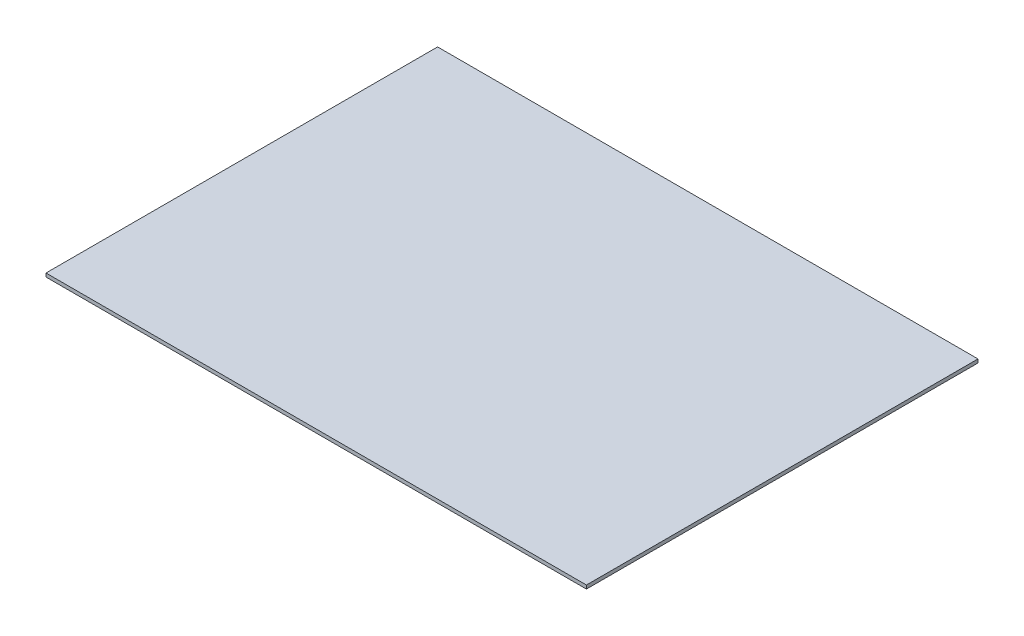
ISO-10303-21;
HEADER;
FILE_DESCRIPTION(('STEP AP214'),'2;1');
FILE_NAME('part.step','',(''),(''),'','','');
FILE_SCHEMA(('AUTOMOTIVE_DESIGN { 1 0 10303 214 1 1 1 1 }'));
ENDSEC;
DATA;
#1=APPLICATION_CONTEXT('core data for automotive mechanical design processes');
#2=APPLICATION_PROTOCOL_DEFINITION('international standard','automotive_design',2000,#1);
#3=PRODUCT_CONTEXT('',#1,'mechanical');
#4=PRODUCT('Part','Part','',(#3));
#5=PRODUCT_RELATED_PRODUCT_CATEGORY('part','',(#4));
#6=PRODUCT_DEFINITION_FORMATION('','',#4);
#7=PRODUCT_DEFINITION_CONTEXT('part definition',#1,'design');
#8=PRODUCT_DEFINITION('design','',#6,#7);
#9=PRODUCT_DEFINITION_SHAPE('','',#8);
#10=(LENGTH_UNIT() NAMED_UNIT(*) SI_UNIT(.MILLI.,.METRE.));
#11=(NAMED_UNIT(*) PLANE_ANGLE_UNIT() SI_UNIT($,.RADIAN.));
#12=(NAMED_UNIT(*) SI_UNIT($,.STERADIAN.) SOLID_ANGLE_UNIT());
#13=UNCERTAINTY_MEASURE_WITH_UNIT(LENGTH_MEASURE(1.E-05),#10,'distance_accuracy_value','');
#14=(GEOMETRIC_REPRESENTATION_CONTEXT(3) GLOBAL_UNCERTAINTY_ASSIGNED_CONTEXT((#13)) GLOBAL_UNIT_ASSIGNED_CONTEXT((#10,
#11,#12)) REPRESENTATION_CONTEXT('',''));
#15=CARTESIAN_POINT('',(0.,0.,0.));
#16=DIRECTION('',(0.,0.,1.));
#17=DIRECTION('',(1.,0.,0.));
#18=AXIS2_PLACEMENT_3D('',#15,#16,#17);
#19=CARTESIAN_POINT('',(-762.5,-10.,-552.5));
#20=DIRECTION('',(-1.,0.,0.));
#21=DIRECTION('',(0.,0.,1.));
#22=AXIS2_PLACEMENT_3D('',#19,#20,#21);
#23=PLANE('',#22);
#24=DIRECTION('',(0.,0.,1.));
#25=VECTOR('',#24,1.);
#26=CARTESIAN_POINT('',(-762.5,0.,-552.5));
#27=LINE('',#26,#25);
#28=CARTESIAN_POINT('',(-762.5,0.,-552.5));
#29=VERTEX_POINT('',#28);
#30=CARTESIAN_POINT('',(-762.5,0.,552.5));
#31=VERTEX_POINT('',#30);
#32=EDGE_CURVE('E117',#29,#31,#27,.T.);
#33=ORIENTED_EDGE('',*,*,#32,.F.);
#34=DIRECTION('',(0.,1.,0.));
#35=VECTOR('',#34,1.);
#36=CARTESIAN_POINT('',(-762.5,-10.,-552.5));
#37=LINE('',#36,#35);
#38=CARTESIAN_POINT('',(-762.5,-10.,-552.5));
#39=VERTEX_POINT('',#38);
#40=EDGE_CURVE('E11',#39,#29,#37,.T.);
#41=ORIENTED_EDGE('',*,*,#40,.F.);
#42=DIRECTION('',(0.,0.,1.));
#43=VECTOR('',#42,1.);
#44=CARTESIAN_POINT('',(-762.5,-10.,-552.5));
#45=LINE('',#44,#43);
#46=CARTESIAN_POINT('',(-762.5,-10.,552.5));
#47=VERTEX_POINT('',#46);
#48=EDGE_CURVE('E107',#39,#47,#45,.T.);
#49=ORIENTED_EDGE('',*,*,#48,.T.);
#50=DIRECTION('',(0.,1.,0.));
#51=VECTOR('',#50,1.);
#52=CARTESIAN_POINT('',(-762.5,-10.,552.5));
#53=LINE('',#52,#51);
#54=EDGE_CURVE('E48',#47,#31,#53,.T.);
#55=ORIENTED_EDGE('',*,*,#54,.T.);
#56=EDGE_LOOP('',(#33,#41,#49,#55));
#57=FACE_BOUND('',#56,.T.);
#58=ADVANCED_FACE('F45',(#57),#23,.T.);
#59=CARTESIAN_POINT('',(-762.5,-10.,-552.5));
#60=DIRECTION('',(0.,0.,-1.));
#61=DIRECTION('',(-1.,0.,0.));
#62=AXIS2_PLACEMENT_3D('',#59,#60,#61);
#63=PLANE('',#62);
#64=DIRECTION('',(-1.,0.,0.));
#65=VECTOR('',#64,1.);
#66=CARTESIAN_POINT('',(-762.5,0.,-552.5));
#67=LINE('',#66,#65);
#68=CARTESIAN_POINT('',(762.5,0.,-552.5));
#69=VERTEX_POINT('',#68);
#70=EDGE_CURVE('E112',#69,#29,#67,.T.);
#71=ORIENTED_EDGE('',*,*,#70,.F.);
#72=DIRECTION('',(0.,1.,0.));
#73=VECTOR('',#72,1.);
#74=CARTESIAN_POINT('',(762.5,-10.,-552.5));
#75=LINE('',#74,#73);
#76=CARTESIAN_POINT('',(762.5,-10.,-552.5));
#77=VERTEX_POINT('',#76);
#78=EDGE_CURVE('E54',#77,#69,#75,.T.);
#79=ORIENTED_EDGE('',*,*,#78,.F.);
#80=DIRECTION('',(-1.,0.,0.));
#81=VECTOR('',#80,1.);
#82=CARTESIAN_POINT('',(-762.5,-10.,-552.5));
#83=LINE('',#82,#81);
#84=EDGE_CURVE('E102',#77,#39,#83,.T.);
#85=ORIENTED_EDGE('',*,*,#84,.T.);
#86=ORIENTED_EDGE('',*,*,#40,.T.);
#87=EDGE_LOOP('',(#71,#79,#85,#86));
#88=FACE_BOUND('',#87,.T.);
#89=ADVANCED_FACE('F130',(#88),#63,.T.);
#90=CARTESIAN_POINT('',(762.5,-10.,-552.5));
#91=DIRECTION('',(1.,0.,0.));
#92=DIRECTION('',(0.,0.,-1.));
#93=AXIS2_PLACEMENT_3D('',#90,#91,#92);
#94=PLANE('',#93);
#95=DIRECTION('',(0.,0.,-1.));
#96=VECTOR('',#95,1.);
#97=CARTESIAN_POINT('',(762.5,0.,-552.5));
#98=LINE('',#97,#96);
#99=CARTESIAN_POINT('',(762.5,0.,552.5));
#100=VERTEX_POINT('',#99);
#101=EDGE_CURVE('E97',#100,#69,#98,.T.);
#102=ORIENTED_EDGE('',*,*,#101,.F.);
#103=DIRECTION('',(0.,1.,0.));
#104=VECTOR('',#103,1.);
#105=CARTESIAN_POINT('',(762.5,-10.,552.5));
#106=LINE('',#105,#104);
#107=CARTESIAN_POINT('',(762.5,-10.,552.5));
#108=VERTEX_POINT('',#107);
#109=EDGE_CURVE('E92',#108,#100,#106,.T.);
#110=ORIENTED_EDGE('',*,*,#109,.F.);
#111=DIRECTION('',(0.,0.,-1.));
#112=VECTOR('',#111,1.);
#113=CARTESIAN_POINT('',(762.5,-10.,-552.5));
#114=LINE('',#113,#112);
#115=EDGE_CURVE('E95',#108,#77,#114,.T.);
#116=ORIENTED_EDGE('',*,*,#115,.T.);
#117=ORIENTED_EDGE('',*,*,#78,.T.);
#118=EDGE_LOOP('',(#102,#110,#116,#117));
#119=FACE_BOUND('',#118,.T.);
#120=ADVANCED_FACE('F94',(#119),#94,.T.);
#121=CARTESIAN_POINT('',(-762.5,-10.,552.5));
#122=DIRECTION('',(0.,0.,1.));
#123=DIRECTION('',(1.,0.,0.));
#124=AXIS2_PLACEMENT_3D('',#121,#122,#123);
#125=PLANE('',#124);
#126=DIRECTION('',(1.,0.,0.));
#127=VECTOR('',#126,1.);
#128=CARTESIAN_POINT('',(-762.5,0.,552.5));
#129=LINE('',#128,#127);
#130=EDGE_CURVE('E120',#31,#100,#129,.T.);
#131=ORIENTED_EDGE('',*,*,#130,.F.);
#132=ORIENTED_EDGE('',*,*,#54,.F.);
#133=DIRECTION('',(1.,0.,0.));
#134=VECTOR('',#133,1.);
#135=CARTESIAN_POINT('',(-762.5,-10.,552.5));
#136=LINE('',#135,#134);
#137=EDGE_CURVE('E101',#47,#108,#136,.T.);
#138=ORIENTED_EDGE('',*,*,#137,.T.);
#139=ORIENTED_EDGE('',*,*,#109,.T.);
#140=EDGE_LOOP('',(#131,#132,#138,#139));
#141=FACE_BOUND('',#140,.T.);
#142=ADVANCED_FACE('F105',(#141),#125,.T.);
#143=CARTESIAN_POINT('',(0.,-10.,0.));
#144=DIRECTION('',(0.,1.,0.));
#145=DIRECTION('',(0.,0.,1.));
#146=AXIS2_PLACEMENT_3D('',#143,#144,#145);
#147=PLANE('',#146);
#148=ORIENTED_EDGE('',*,*,#48,.F.);
#149=ORIENTED_EDGE('',*,*,#84,.F.);
#150=ORIENTED_EDGE('',*,*,#115,.F.);
#151=ORIENTED_EDGE('',*,*,#137,.F.);
#152=EDGE_LOOP('',(#148,#149,#150,#151));
#153=FACE_BOUND('',#152,.T.);
#154=ADVANCED_FACE('F100',(#153),#147,.F.);
#155=CARTESIAN_POINT('',(0.,0.,0.));
#156=DIRECTION('',(0.,1.,0.));
#157=DIRECTION('',(0.,0.,1.));
#158=AXIS2_PLACEMENT_3D('',#155,#156,#157);
#159=PLANE('',#158);
#160=ORIENTED_EDGE('',*,*,#32,.T.);
#161=ORIENTED_EDGE('',*,*,#130,.T.);
#162=ORIENTED_EDGE('',*,*,#101,.T.);
#163=ORIENTED_EDGE('',*,*,#70,.T.);
#164=EDGE_LOOP('',(#160,#161,#162,#163));
#165=FACE_BOUND('',#164,.T.);
#166=ADVANCED_FACE('F129',(#165),#159,.T.);
#167=CLOSED_SHELL('',(#58,#89,#120,#142,#154,#166));
#168=MANIFOLD_SOLID_BREP('B2',#167);
#169=ADVANCED_BREP_SHAPE_REPRESENTATION('',(#18,#168),#14);
#170=SHAPE_DEFINITION_REPRESENTATION(#9,#169);
ENDSEC;
END-ISO-10303-21;
